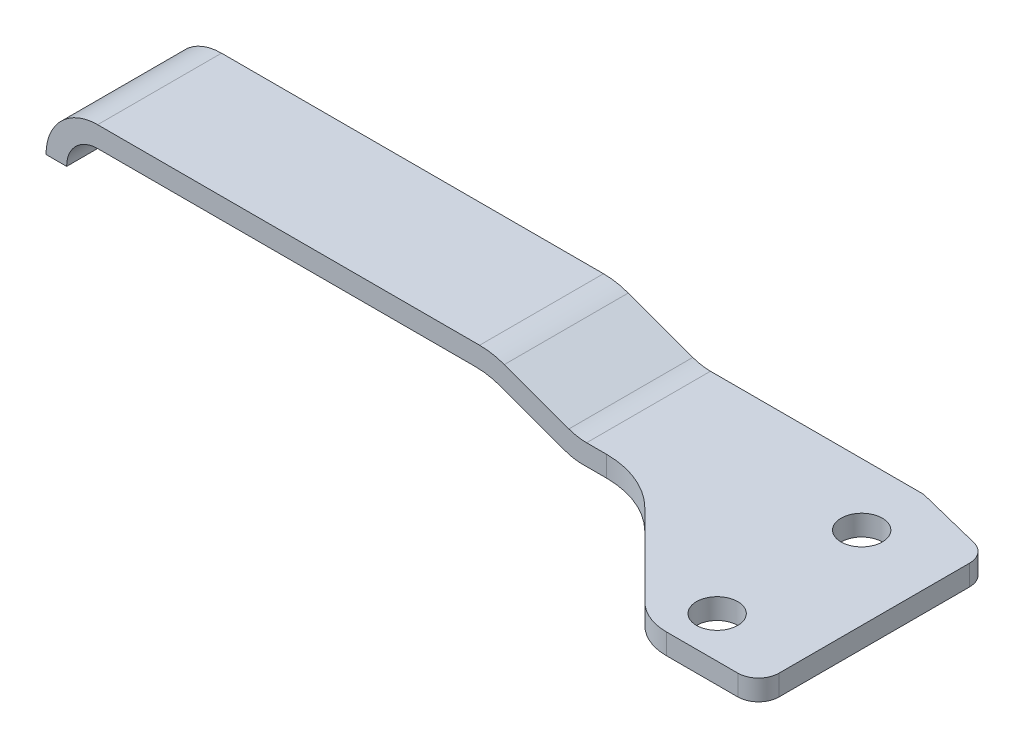
ISO-10303-21;
HEADER;
FILE_DESCRIPTION(('STEP AP214'),'2;1');
FILE_NAME('part.step','',(''),(''),'','','');
FILE_SCHEMA(('AUTOMOTIVE_DESIGN { 1 0 10303 214 1 1 1 1 }'));
ENDSEC;
DATA;
#1=APPLICATION_CONTEXT('core data for automotive mechanical design processes');
#2=APPLICATION_PROTOCOL_DEFINITION('international standard','automotive_design',2000,#1);
#3=PRODUCT_CONTEXT('',#1,'mechanical');
#4=PRODUCT('Part','Part','',(#3));
#5=PRODUCT_RELATED_PRODUCT_CATEGORY('part','',(#4));
#6=PRODUCT_DEFINITION_FORMATION('','',#4);
#7=PRODUCT_DEFINITION_CONTEXT('part definition',#1,'design');
#8=PRODUCT_DEFINITION('design','',#6,#7);
#9=PRODUCT_DEFINITION_SHAPE('','',#8);
#10=(LENGTH_UNIT() NAMED_UNIT(*) SI_UNIT(.MILLI.,.METRE.));
#11=(NAMED_UNIT(*) PLANE_ANGLE_UNIT() SI_UNIT($,.RADIAN.));
#12=(NAMED_UNIT(*) SI_UNIT($,.STERADIAN.) SOLID_ANGLE_UNIT());
#13=UNCERTAINTY_MEASURE_WITH_UNIT(LENGTH_MEASURE(1.E-05),#10,'distance_accuracy_value','');
#14=(GEOMETRIC_REPRESENTATION_CONTEXT(3) GLOBAL_UNCERTAINTY_ASSIGNED_CONTEXT((#13)) GLOBAL_UNIT_ASSIGNED_CONTEXT((#10,
#11,#12)) REPRESENTATION_CONTEXT('',''));
#15=CARTESIAN_POINT('',(0.,0.,0.));
#16=DIRECTION('',(0.,0.,1.));
#17=DIRECTION('',(1.,0.,0.));
#18=AXIS2_PLACEMENT_3D('',#15,#16,#17);
#19=CARTESIAN_POINT('',(64.3001,7.9375,-19.05));
#20=DIRECTION('',(-1.,0.,0.));
#21=DIRECTION('',(0.,0.,1.));
#22=AXIS2_PLACEMENT_3D('',#19,#20,#21);
#23=PLANE('',#22);
#24=DIRECTION('',(0.,0.,-1.));
#25=VECTOR('',#24,1.);
#26=CARTESIAN_POINT('',(64.3001,3.175,19.05));
#27=LINE('',#26,#25);
#28=CARTESIAN_POINT('',(64.3001,3.175,15.875));
#29=VERTEX_POINT('',#28);
#30=CARTESIAN_POINT('',(64.3001,3.175,-13.4029524997328));
#31=VERTEX_POINT('',#30);
#32=EDGE_CURVE('E307',#29,#31,#27,.T.);
#33=ORIENTED_EDGE('',*,*,#32,.F.);
#34=DIRECTION('',(0.,-1.,0.));
#35=VECTOR('',#34,1.);
#36=CARTESIAN_POINT('',(64.3001,7.9375,15.875));
#37=LINE('',#36,#35);
#38=CARTESIAN_POINT('',(64.3001,0.,15.875));
#39=VERTEX_POINT('',#38);
#40=EDGE_CURVE('E296',#29,#39,#37,.T.);
#41=ORIENTED_EDGE('',*,*,#40,.T.);
#42=DIRECTION('',(0.,0.,-1.));
#43=VECTOR('',#42,1.);
#44=CARTESIAN_POINT('',(64.3001,0.,-19.05));
#45=LINE('',#44,#43);
#46=CARTESIAN_POINT('',(64.3001,0.,-13.4029524997328));
#47=VERTEX_POINT('',#46);
#48=EDGE_CURVE('E273',#39,#47,#45,.T.);
#49=ORIENTED_EDGE('',*,*,#48,.T.);
#50=DIRECTION('',(0.,1.,0.));
#51=VECTOR('',#50,1.);
#52=CARTESIAN_POINT('',(64.3001,7.9375,-13.4029524997328));
#53=LINE('',#52,#51);
#54=EDGE_CURVE('E293',#47,#31,#53,.T.);
#55=ORIENTED_EDGE('',*,*,#54,.T.);
#56=EDGE_LOOP('',(#33,#41,#49,#55));
#57=FACE_BOUND('',#56,.T.);
#58=ADVANCED_FACE('F164',(#57),#23,.F.);
#59=CARTESIAN_POINT('',(-64.3001,7.9375,-19.05));
#60=DIRECTION('',(0.,0.,1.));
#61=DIRECTION('',(1.,0.,0.));
#62=AXIS2_PLACEMENT_3D('',#59,#60,#61);
#63=PLANE('',#62);
#64=CARTESIAN_POINT('',(-56.3626,0.,-19.05));
#65=DIRECTION('',(0.,0.,-1.));
#66=DIRECTION('',(-1.,0.,0.));
#67=AXIS2_PLACEMENT_3D('',#64,#65,#66);
#68=CIRCLE('',#67,7.93749999999999);
#69=CARTESIAN_POINT('',(-64.3001,0.,-19.05));
#70=VERTEX_POINT('',#69);
#71=CARTESIAN_POINT('',(-56.3626,7.9375,-19.05));
#72=VERTEX_POINT('',#71);
#73=EDGE_CURVE('E168',#70,#72,#68,.T.);
#74=ORIENTED_EDGE('',*,*,#73,.T.);
#75=DIRECTION('',(-1.,0.,0.));
#76=VECTOR('',#75,1.);
#77=CARTESIAN_POINT('',(-64.3001,7.9375,-19.05));
#78=LINE('',#77,#76);
#79=CARTESIAN_POINT('',(2.37489999999999,7.9375,-19.05));
#80=VERTEX_POINT('',#79);
#81=EDGE_CURVE('E249',#80,#72,#78,.T.);
#82=ORIENTED_EDGE('',*,*,#81,.F.);
#83=CARTESIAN_POINT('',(2.37489999999999,-3.1877,-19.05));
#84=DIRECTION('',(0.,0.,-1.));
#85=DIRECTION('',(-1.,0.,0.));
#86=AXIS2_PLACEMENT_3D('',#83,#84,#85);
#87=CIRCLE('',#86,11.1252);
#88=CARTESIAN_POINT('',(6.17994249852665,7.26656834476741,-19.05));
#89=VERTEX_POINT('',#88);
#90=EDGE_CURVE('E337',#80,#89,#87,.T.);
#91=ORIENTED_EDGE('',*,*,#90,.T.);
#92=DIRECTION('',(-0.939692620785911,0.342020143325663,0.));
#93=VECTOR('',#92,1.);
#94=CARTESIAN_POINT('',(16.1041403544914,3.65445572622783,-19.05));
#95=LINE('',#94,#93);
#96=CARTESIAN_POINT('',(16.1041403544914,3.65445572622785,-19.05));
#97=VERTEX_POINT('',#96);
#98=EDGE_CURVE('E333',#89,#97,#95,.F.);
#99=ORIENTED_EDGE('',*,*,#98,.T.);
#100=CARTESIAN_POINT('',(18.8232688979591,11.1252,-19.05));
#101=DIRECTION('',(0.,0.,-1.));
#102=DIRECTION('',(-1.,0.,0.));
#103=AXIS2_PLACEMENT_3D('',#100,#101,#102);
#104=CIRCLE('',#103,7.9502);
#105=CARTESIAN_POINT('',(18.8232688979591,3.175,-19.05));
#106=VERTEX_POINT('',#105);
#107=EDGE_CURVE('E331',#106,#97,#104,.T.);
#108=ORIENTED_EDGE('',*,*,#107,.F.);
#109=DIRECTION('',(-1.,0.,0.));
#110=VECTOR('',#109,1.);
#111=CARTESIAN_POINT('',(-64.3001,3.17500000000002,-19.05));
#112=LINE('',#111,#110);
#113=CARTESIAN_POINT('',(51.2102590191333,3.175,-19.05));
#114=VERTEX_POINT('',#113);
#115=EDGE_CURVE('E402',#114,#106,#112,.T.);
#116=ORIENTED_EDGE('',*,*,#115,.F.);
#117=DIRECTION('',(0.,1.,0.));
#118=VECTOR('',#117,1.);
#119=CARTESIAN_POINT('',(51.2102590191333,7.9375,-19.05));
#120=LINE('',#119,#118);
#121=CARTESIAN_POINT('',(51.2102590191333,0.,-19.05));
#122=VERTEX_POINT('',#121);
#123=EDGE_CURVE('E281',#114,#122,#120,.F.);
#124=ORIENTED_EDGE('',*,*,#123,.T.);
#125=DIRECTION('',(-1.,0.,0.));
#126=VECTOR('',#125,1.);
#127=CARTESIAN_POINT('',(-64.3001,0.,-19.05));
#128=LINE('',#127,#126);
#129=CARTESIAN_POINT('',(17.8007076247308,0.,-19.05));
#130=VERTEX_POINT('',#129);
#131=EDGE_CURVE('E276',#122,#130,#128,.T.);
#132=ORIENTED_EDGE('',*,*,#131,.T.);
#133=CARTESIAN_POINT('',(18.2499,7.9375,-19.05));
#134=DIRECTION('',(0.,0.,-1.));
#135=DIRECTION('',(-1.,0.,0.));
#136=AXIS2_PLACEMENT_3D('',#133,#134,#135);
#137=CIRCLE('',#136,7.9502);
#138=CARTESIAN_POINT('',(15.5307714565323,0.466755726227857,-19.05));
#139=VERTEX_POINT('',#138);
#140=EDGE_CURVE('E255',#130,#139,#137,.T.);
#141=ORIENTED_EDGE('',*,*,#140,.T.);
#142=DIRECTION('',(-0.939692620785911,0.342020143325663,0.));
#143=VECTOR('',#142,1.);
#144=CARTESIAN_POINT('',(1.96676754123714,5.40364940886543,-19.05));
#145=LINE('',#144,#143);
#146=CARTESIAN_POINT('',(5.57168063734052,4.09156834476741,-19.05));
#147=VERTEX_POINT('',#146);
#148=EDGE_CURVE('E345',#147,#139,#145,.F.);
#149=ORIENTED_EDGE('',*,*,#148,.F.);
#150=CARTESIAN_POINT('',(1.76663813881386,-6.36270000000001,-19.05));
#151=DIRECTION('',(0.,0.,-1.));
#152=DIRECTION('',(-1.,0.,0.));
#153=AXIS2_PLACEMENT_3D('',#150,#151,#152);
#154=CIRCLE('',#153,11.1252);
#155=CARTESIAN_POINT('',(1.76663813881386,4.76249999999999,-19.05));
#156=VERTEX_POINT('',#155);
#157=EDGE_CURVE('E343',#156,#147,#154,.T.);
#158=ORIENTED_EDGE('',*,*,#157,.F.);
#159=DIRECTION('',(-1.,0.,0.));
#160=VECTOR('',#159,1.);
#161=CARTESIAN_POINT('',(0.,4.76249999999999,-19.05));
#162=LINE('',#161,#160);
#163=CARTESIAN_POINT('',(-56.3626,4.7625,-19.05));
#164=VERTEX_POINT('',#163);
#165=EDGE_CURVE('E341',#164,#156,#162,.F.);
#166=ORIENTED_EDGE('',*,*,#165,.F.);
#167=CARTESIAN_POINT('',(-56.3626,0.,-19.05));
#168=DIRECTION('',(0.,0.,-1.));
#169=DIRECTION('',(-1.,0.,0.));
#170=AXIS2_PLACEMENT_3D('',#167,#168,#169);
#171=CIRCLE('',#170,4.7625);
#172=CARTESIAN_POINT('',(-61.1251,0.,-19.05));
#173=VERTEX_POINT('',#172);
#174=EDGE_CURVE('E339',#173,#164,#171,.T.);
#175=ORIENTED_EDGE('',*,*,#174,.F.);
#176=EDGE_CURVE('E252',#173,#70,#128,.T.);
#177=ORIENTED_EDGE('',*,*,#176,.T.);
#178=EDGE_LOOP('',(#74,#82,#91,#99,#108,#116,#124,#132,#141,#149,#158,#166,#175,#177));
#179=FACE_BOUND('',#178,.T.);
#180=ADVANCED_FACE('F247',(#179),#63,.F.);
#181=CARTESIAN_POINT('',(-64.3001,7.9375,19.05));
#182=DIRECTION('',(0.,0.,-1.));
#183=DIRECTION('',(-1.,0.,0.));
#184=AXIS2_PLACEMENT_3D('',#181,#182,#183);
#185=PLANE('',#184);
#186=DIRECTION('',(1.,0.,0.));
#187=VECTOR('',#186,1.);
#188=CARTESIAN_POINT('',(0.,3.17500000000001,19.05));
#189=LINE('',#188,#187);
#190=CARTESIAN_POINT('',(50.1269,3.175,19.05));
#191=VERTEX_POINT('',#190);
#192=CARTESIAN_POINT('',(61.1251,3.175,19.05));
#193=VERTEX_POINT('',#192);
#194=EDGE_CURVE('E242',#191,#193,#189,.T.);
#195=ORIENTED_EDGE('',*,*,#194,.F.);
#196=DIRECTION('',(0.,1.,0.));
#197=VECTOR('',#196,1.);
#198=CARTESIAN_POINT('',(50.1269,0.,19.05));
#199=LINE('',#198,#197);
#200=CARTESIAN_POINT('',(50.1269,0.,19.05));
#201=VERTEX_POINT('',#200);
#202=EDGE_CURVE('E434',#201,#191,#199,.T.);
#203=ORIENTED_EDGE('',*,*,#202,.F.);
#204=DIRECTION('',(1.,0.,0.));
#205=VECTOR('',#204,1.);
#206=CARTESIAN_POINT('',(-64.3001,0.,19.05));
#207=LINE('',#206,#205);
#208=CARTESIAN_POINT('',(61.1251,0.,19.05));
#209=VERTEX_POINT('',#208);
#210=EDGE_CURVE('E261',#201,#209,#207,.T.);
#211=ORIENTED_EDGE('',*,*,#210,.T.);
#212=DIRECTION('',(0.,-1.,0.));
#213=VECTOR('',#212,1.);
#214=CARTESIAN_POINT('',(61.1251,7.9375,19.05));
#215=LINE('',#214,#213);
#216=EDGE_CURVE('E299',#209,#193,#215,.F.);
#217=ORIENTED_EDGE('',*,*,#216,.T.);
#218=EDGE_LOOP('',(#195,#203,#211,#217));
#219=FACE_BOUND('',#218,.T.);
#220=ADVANCED_FACE('F460',(#219),#185,.F.);
#221=CARTESIAN_POINT('',(0.,7.9375,0.));
#222=DIRECTION('',(0.,1.,0.));
#223=DIRECTION('',(0.,0.,1.));
#224=AXIS2_PLACEMENT_3D('',#221,#222,#223);
#225=PLANE('',#224);
#226=DIRECTION('',(0.,0.,-1.));
#227=VECTOR('',#226,1.);
#228=CARTESIAN_POINT('',(-56.3626,7.9375,19.05));
#229=LINE('',#228,#227);
#230=CARTESIAN_POINT('',(-56.3626,7.9375,0.));
#231=VERTEX_POINT('',#230);
#232=EDGE_CURVE('E235',#231,#72,#229,.T.);
#233=ORIENTED_EDGE('',*,*,#232,.F.);
#234=DIRECTION('',(-1.,0.,0.));
#235=VECTOR('',#234,1.);
#236=CARTESIAN_POINT('',(-64.3001,7.9375,0.));
#237=LINE('',#236,#235);
#238=CARTESIAN_POINT('',(2.37489999999999,7.9375,0.));
#239=VERTEX_POINT('',#238);
#240=EDGE_CURVE('E421',#239,#231,#237,.T.);
#241=ORIENTED_EDGE('',*,*,#240,.F.);
#242=DIRECTION('',(0.,0.,-1.));
#243=VECTOR('',#242,1.);
#244=CARTESIAN_POINT('',(2.37489999999999,7.9375,19.05));
#245=LINE('',#244,#243);
#246=EDGE_CURVE('E259',#239,#80,#245,.T.);
#247=ORIENTED_EDGE('',*,*,#246,.T.);
#248=ORIENTED_EDGE('',*,*,#81,.T.);
#249=EDGE_LOOP('',(#233,#241,#247,#248));
#250=FACE_BOUND('',#249,.T.);
#251=ADVANCED_FACE('F257',(#250),#225,.T.);
#252=CARTESIAN_POINT('',(0.,0.,0.));
#253=DIRECTION('',(0.,1.,0.));
#254=DIRECTION('',(0.,0.,1.));
#255=AXIS2_PLACEMENT_3D('',#252,#253,#254);
#256=PLANE('',#255);
#257=CARTESIAN_POINT('',(51.6001,0.,-9.525));
#258=DIRECTION('',(0.,1.,0.));
#259=DIRECTION('',(0.,0.,1.));
#260=AXIS2_PLACEMENT_3D('',#257,#258,#259);
#261=CIRCLE('',#260,3.175);
#262=CARTESIAN_POINT('',(51.6001,0.,-6.35));
#263=VERTEX_POINT('',#262);
#264=EDGE_CURVE('E418',#263,#263,#261,.T.);
#265=ORIENTED_EDGE('',*,*,#264,.T.);
#266=EDGE_LOOP('',(#265));
#267=FACE_BOUND('',#266,.T.);
#268=CARTESIAN_POINT('',(51.6001,0.,12.7));
#269=DIRECTION('',(0.,1.,0.));
#270=DIRECTION('',(0.,0.,1.));
#271=AXIS2_PLACEMENT_3D('',#268,#269,#270);
#272=CIRCLE('',#271,3.175);
#273=CARTESIAN_POINT('',(51.6001,0.,15.875));
#274=VERTEX_POINT('',#273);
#275=EDGE_CURVE('E254',#274,#274,#272,.T.);
#276=ORIENTED_EDGE('',*,*,#275,.T.);
#277=EDGE_LOOP('',(#276));
#278=FACE_BOUND('',#277,.T.);
#279=DIRECTION('',(0.,0.,-1.));
#280=VECTOR('',#279,1.);
#281=CARTESIAN_POINT('',(17.8007076247308,0.,19.05));
#282=LINE('',#281,#280);
#283=CARTESIAN_POINT('',(17.8007076247308,0.,0.));
#284=VERTEX_POINT('',#283);
#285=EDGE_CURVE('E243',#284,#130,#282,.T.);
#286=ORIENTED_EDGE('',*,*,#285,.T.);
#287=ORIENTED_EDGE('',*,*,#131,.F.);
#288=CARTESIAN_POINT('',(51.2102590191333,0.,-15.875));
#289=DIRECTION('',(0.,1.,0.));
#290=DIRECTION('',(0.,0.,1.));
#291=AXIS2_PLACEMENT_3D('',#288,#289,#290);
#292=CIRCLE('',#291,3.175);
#293=CARTESIAN_POINT('',(51.9783610376622,0.,-18.9556889309263));
#294=VERTEX_POINT('',#293);
#295=EDGE_CURVE('E290',#122,#294,#292,.F.);
#296=ORIENTED_EDGE('',*,*,#295,.T.);
#297=DIRECTION('',(0.970295726275998,0.,0.241921895599662));
#298=VECTOR('',#297,1.);
#299=CARTESIAN_POINT('',(51.6001,0.,-19.05));
#300=LINE('',#299,#298);
#301=CARTESIAN_POINT('',(61.8932020185289,0.,-16.4836414306591));
#302=VERTEX_POINT('',#301);
#303=EDGE_CURVE('E271',#294,#302,#300,.T.);
#304=ORIENTED_EDGE('',*,*,#303,.T.);
#305=CARTESIAN_POINT('',(61.1251,0.,-13.4029524997328));
#306=DIRECTION('',(0.,1.,0.));
#307=DIRECTION('',(0.,0.,1.));
#308=AXIS2_PLACEMENT_3D('',#305,#306,#307);
#309=CIRCLE('',#308,3.175);
#310=EDGE_CURVE('E284',#302,#47,#309,.F.);
#311=ORIENTED_EDGE('',*,*,#310,.T.);
#312=ORIENTED_EDGE('',*,*,#48,.F.);
#313=CARTESIAN_POINT('',(61.1251,0.,15.875));
#314=DIRECTION('',(0.,1.,0.));
#315=DIRECTION('',(0.,0.,1.));
#316=AXIS2_PLACEMENT_3D('',#313,#314,#315);
#317=CIRCLE('',#316,3.175);
#318=EDGE_CURVE('E287',#39,#209,#317,.F.);
#319=ORIENTED_EDGE('',*,*,#318,.T.);
#320=ORIENTED_EDGE('',*,*,#210,.F.);
#321=CARTESIAN_POINT('',(50.1269,0.,11.0998));
#322=DIRECTION('',(0.,-1.,0.));
#323=DIRECTION('',(0.,0.,1.));
#324=AXIS2_PLACEMENT_3D('',#321,#322,#323);
#325=CIRCLE('',#324,7.9502);
#326=CARTESIAN_POINT('',(44.5052596682107,0.,16.7214403317893));
#327=VERTEX_POINT('',#326);
#328=EDGE_CURVE('E424',#201,#327,#325,.T.);
#329=ORIENTED_EDGE('',*,*,#328,.T.);
#330=DIRECTION('',(-0.707106781186552,0.,-0.707106781186543));
#331=VECTOR('',#330,1.);
#332=CARTESIAN_POINT('',(31.9722509440973,0.,4.18843160767608));
#333=LINE('',#332,#331);
#334=CARTESIAN_POINT('',(31.9722509440973,0.,4.18843160767608));
#335=VERTEX_POINT('',#334);
#336=EDGE_CURVE('E427',#327,#335,#333,.T.);
#337=ORIENTED_EDGE('',*,*,#336,.T.);
#338=CARTESIAN_POINT('',(21.8604825517735,0.,14.3002));
#339=DIRECTION('',(0.,1.,0.));
#340=DIRECTION('',(0.,0.,1.));
#341=AXIS2_PLACEMENT_3D('',#338,#339,#340);
#342=CIRCLE('',#341,14.3002);
#343=CARTESIAN_POINT('',(21.8604825517735,0.,0.));
#344=VERTEX_POINT('',#343);
#345=EDGE_CURVE('E430',#335,#344,#342,.T.);
#346=ORIENTED_EDGE('',*,*,#345,.T.);
#347=DIRECTION('',(-1.,0.,0.));
#348=VECTOR('',#347,1.);
#349=CARTESIAN_POINT('',(-64.3001,0.,0.));
#350=LINE('',#349,#348);
#351=EDGE_CURVE('E365',#344,#284,#350,.T.);
#352=ORIENTED_EDGE('',*,*,#351,.T.);
#353=EDGE_LOOP('',(#286,#287,#296,#304,#311,#312,#319,#320,#329,#337,#346,#352));
#354=FACE_BOUND('',#353,.T.);
#355=ADVANCED_FACE('F360',(#267,#278,#354),#256,.F.);
#356=CARTESIAN_POINT('',(51.6001,0.,-19.05));
#357=DIRECTION('',(-0.241921895599662,0.,0.970295726275998));
#358=DIRECTION('',(0.970295726275998,0.,0.241921895599662));
#359=AXIS2_PLACEMENT_3D('',#356,#357,#358);
#360=PLANE('',#359);
#361=DIRECTION('',(-0.970295726275998,0.,-0.241921895599662));
#362=VECTOR('',#361,1.);
#363=CARTESIAN_POINT('',(51.6001,3.175,-19.05));
#364=LINE('',#363,#362);
#365=CARTESIAN_POINT('',(61.8932020185289,3.175,-16.4836414306591));
#366=VERTEX_POINT('',#365);
#367=CARTESIAN_POINT('',(51.9783610376622,3.175,-18.9556889309263));
#368=VERTEX_POINT('',#367);
#369=EDGE_CURVE('E396',#366,#368,#364,.T.);
#370=ORIENTED_EDGE('',*,*,#369,.F.);
#371=DIRECTION('',(0.,1.,0.));
#372=VECTOR('',#371,1.);
#373=CARTESIAN_POINT('',(61.8932020185289,0.,-16.4836414306591));
#374=LINE('',#373,#372);
#375=EDGE_CURVE('E260',#366,#302,#374,.F.);
#376=ORIENTED_EDGE('',*,*,#375,.T.);
#377=ORIENTED_EDGE('',*,*,#303,.F.);
#378=DIRECTION('',(0.,1.,0.));
#379=VECTOR('',#378,1.);
#380=CARTESIAN_POINT('',(51.9783610376622,0.,-18.9556889309263));
#381=LINE('',#380,#379);
#382=EDGE_CURVE('E264',#294,#368,#381,.T.);
#383=ORIENTED_EDGE('',*,*,#382,.T.);
#384=EDGE_LOOP('',(#370,#376,#377,#383));
#385=FACE_BOUND('',#384,.T.);
#386=ADVANCED_FACE('F546',(#385),#360,.F.);
#387=CARTESIAN_POINT('',(-64.3001,0.,0.));
#388=DIRECTION('',(0.,0.,-1.));
#389=DIRECTION('',(-1.,0.,0.));
#390=AXIS2_PLACEMENT_3D('',#387,#388,#389);
#391=PLANE('',#390);
#392=CARTESIAN_POINT('',(-56.3626,0.,0.));
#393=DIRECTION('',(0.,0.,-1.));
#394=DIRECTION('',(-1.,0.,0.));
#395=AXIS2_PLACEMENT_3D('',#392,#393,#394);
#396=CIRCLE('',#395,7.93749999999999);
#397=CARTESIAN_POINT('',(-64.3001,0.,0.));
#398=VERTEX_POINT('',#397);
#399=EDGE_CURVE('E12',#398,#231,#396,.T.);
#400=ORIENTED_EDGE('',*,*,#399,.F.);
#401=CARTESIAN_POINT('',(-61.1251,0.,0.));
#402=VERTEX_POINT('',#401);
#403=EDGE_CURVE('E432',#402,#398,#350,.T.);
#404=ORIENTED_EDGE('',*,*,#403,.F.);
#405=CARTESIAN_POINT('',(-56.3626,0.,0.));
#406=DIRECTION('',(0.,0.,-1.));
#407=DIRECTION('',(-1.,0.,0.));
#408=AXIS2_PLACEMENT_3D('',#405,#406,#407);
#409=CIRCLE('',#408,4.7625);
#410=CARTESIAN_POINT('',(-56.3626,4.7625,0.));
#411=VERTEX_POINT('',#410);
#412=EDGE_CURVE('E316',#402,#411,#409,.T.);
#413=ORIENTED_EDGE('',*,*,#412,.T.);
#414=DIRECTION('',(1.,0.,0.));
#415=VECTOR('',#414,1.);
#416=CARTESIAN_POINT('',(-64.3001,4.7625,0.));
#417=LINE('',#416,#415);
#418=CARTESIAN_POINT('',(1.76663813881386,4.76249999999999,0.));
#419=VERTEX_POINT('',#418);
#420=EDGE_CURVE('E319',#411,#419,#417,.T.);
#421=ORIENTED_EDGE('',*,*,#420,.T.);
#422=CARTESIAN_POINT('',(1.76663813881386,-6.36270000000001,0.));
#423=DIRECTION('',(0.,0.,-1.));
#424=DIRECTION('',(-1.,0.,0.));
#425=AXIS2_PLACEMENT_3D('',#422,#423,#424);
#426=CIRCLE('',#425,11.1252);
#427=CARTESIAN_POINT('',(5.57168063734052,4.0915683447674,0.));
#428=VERTEX_POINT('',#427);
#429=EDGE_CURVE('E322',#419,#428,#426,.T.);
#430=ORIENTED_EDGE('',*,*,#429,.T.);
#431=DIRECTION('',(0.939692620785911,-0.342020143325663,0.));
#432=VECTOR('',#431,1.);
#433=CARTESIAN_POINT('',(-54.8116496072604,26.0693031996679,0.));
#434=LINE('',#433,#432);
#435=CARTESIAN_POINT('',(15.5307714565323,0.466755726227857,0.));
#436=VERTEX_POINT('',#435);
#437=EDGE_CURVE('E325',#428,#436,#434,.T.);
#438=ORIENTED_EDGE('',*,*,#437,.T.);
#439=CARTESIAN_POINT('',(18.2499,7.9375,0.));
#440=DIRECTION('',(0.,0.,-1.));
#441=DIRECTION('',(-1.,0.,0.));
#442=AXIS2_PLACEMENT_3D('',#439,#440,#441);
#443=CIRCLE('',#442,7.9502);
#444=EDGE_CURVE('E174',#284,#436,#443,.T.);
#445=ORIENTED_EDGE('',*,*,#444,.F.);
#446=ORIENTED_EDGE('',*,*,#351,.F.);
#447=DIRECTION('',(0.,1.,0.));
#448=VECTOR('',#447,1.);
#449=CARTESIAN_POINT('',(21.8604825517735,0.,0.));
#450=LINE('',#449,#448);
#451=CARTESIAN_POINT('',(21.8604825517735,3.175,0.));
#452=VERTEX_POINT('',#451);
#453=EDGE_CURVE('E436',#344,#452,#450,.T.);
#454=ORIENTED_EDGE('',*,*,#453,.T.);
#455=DIRECTION('',(1.,0.,0.));
#456=VECTOR('',#455,1.);
#457=CARTESIAN_POINT('',(-64.3001,3.17500000000002,0.));
#458=LINE('',#457,#456);
#459=CARTESIAN_POINT('',(18.8232688979591,3.175,0.));
#460=VERTEX_POINT('',#459);
#461=EDGE_CURVE('E334',#460,#452,#458,.T.);
#462=ORIENTED_EDGE('',*,*,#461,.F.);
#463=CARTESIAN_POINT('',(18.8232688979591,11.1252,0.));
#464=DIRECTION('',(0.,0.,-1.));
#465=DIRECTION('',(-1.,0.,0.));
#466=AXIS2_PLACEMENT_3D('',#463,#464,#465);
#467=CIRCLE('',#466,7.9502);
#468=CARTESIAN_POINT('',(16.1041403544914,3.65445572622785,0.));
#469=VERTEX_POINT('',#468);
#470=EDGE_CURVE('E302',#460,#469,#467,.T.);
#471=ORIENTED_EDGE('',*,*,#470,.T.);
#472=DIRECTION('',(0.939692620785911,-0.342020143325663,0.));
#473=VECTOR('',#472,1.);
#474=CARTESIAN_POINT('',(-53.7200711556514,29.0683903470269,0.));
#475=LINE('',#474,#473);
#476=CARTESIAN_POINT('',(6.17994249852665,7.26656834476741,0.));
#477=VERTEX_POINT('',#476);
#478=EDGE_CURVE('E310',#477,#469,#475,.T.);
#479=ORIENTED_EDGE('',*,*,#478,.F.);
#480=CARTESIAN_POINT('',(2.37489999999999,-3.1877,0.));
#481=DIRECTION('',(0.,0.,-1.));
#482=DIRECTION('',(-1.,0.,0.));
#483=AXIS2_PLACEMENT_3D('',#480,#481,#482);
#484=CIRCLE('',#483,11.1252);
#485=EDGE_CURVE('E313',#239,#477,#484,.T.);
#486=ORIENTED_EDGE('',*,*,#485,.F.);
#487=ORIENTED_EDGE('',*,*,#240,.T.);
#488=EDGE_LOOP('',(#400,#404,#413,#421,#430,#438,#445,#446,#454,#462,#471,#479,#486,#487));
#489=FACE_BOUND('',#488,.T.);
#490=ADVANCED_FACE('F526',(#489),#391,.F.);
#491=CARTESIAN_POINT('',(21.8604825517735,0.,14.3002));
#492=DIRECTION('',(0.,1.,0.));
#493=DIRECTION('',(0.,0.,1.));
#494=AXIS2_PLACEMENT_3D('',#491,#492,#493);
#495=CYLINDRICAL_SURFACE('',#494,14.3002);
#496=CARTESIAN_POINT('',(21.8604825517735,3.175,14.3002));
#497=DIRECTION('',(0.,1.,0.));
#498=DIRECTION('',(-1.,0.,0.));
#499=AXIS2_PLACEMENT_3D('',#496,#497,#498);
#500=CIRCLE('',#499,14.3002);
#501=CARTESIAN_POINT('',(31.9722509440973,3.175,4.18843160767608));
#502=VERTEX_POINT('',#501);
#503=EDGE_CURVE('E413',#452,#502,#500,.F.);
#504=ORIENTED_EDGE('',*,*,#503,.F.);
#505=ORIENTED_EDGE('',*,*,#453,.F.);
#506=ORIENTED_EDGE('',*,*,#345,.F.);
#507=DIRECTION('',(0.,1.,0.));
#508=VECTOR('',#507,1.);
#509=CARTESIAN_POINT('',(31.9722509440973,0.,4.18843160767608));
#510=LINE('',#509,#508);
#511=EDGE_CURVE('E439',#335,#502,#510,.T.);
#512=ORIENTED_EDGE('',*,*,#511,.T.);
#513=EDGE_LOOP('',(#504,#505,#506,#512));
#514=FACE_BOUND('',#513,.T.);
#515=ADVANCED_FACE('F557',(#514),#495,.F.);
#516=CARTESIAN_POINT('',(31.9722509440973,0.,4.18843160767608));
#517=DIRECTION('',(0.707106781186543,0.,-0.707106781186552));
#518=DIRECTION('',(-0.707106781186552,0.,-0.707106781186543));
#519=AXIS2_PLACEMENT_3D('',#516,#517,#518);
#520=PLANE('',#519);
#521=DIRECTION('',(0.707106781186552,0.,0.707106781186543));
#522=VECTOR('',#521,1.);
#523=CARTESIAN_POINT('',(31.9722509440973,3.175,4.18843160767608));
#524=LINE('',#523,#522);
#525=CARTESIAN_POINT('',(44.5052596682107,3.175,16.7214403317893));
#526=VERTEX_POINT('',#525);
#527=EDGE_CURVE('E410',#502,#526,#524,.T.);
#528=ORIENTED_EDGE('',*,*,#527,.F.);
#529=ORIENTED_EDGE('',*,*,#511,.F.);
#530=ORIENTED_EDGE('',*,*,#336,.F.);
#531=DIRECTION('',(0.,1.,0.));
#532=VECTOR('',#531,1.);
#533=CARTESIAN_POINT('',(44.5052596682107,0.,16.7214403317893));
#534=LINE('',#533,#532);
#535=EDGE_CURVE('E442',#327,#526,#534,.T.);
#536=ORIENTED_EDGE('',*,*,#535,.T.);
#537=EDGE_LOOP('',(#528,#529,#530,#536));
#538=FACE_BOUND('',#537,.T.);
#539=ADVANCED_FACE('F554',(#538),#520,.F.);
#540=CARTESIAN_POINT('',(50.1269,0.,11.0998));
#541=DIRECTION('',(0.,1.,0.));
#542=DIRECTION('',(0.,0.,1.));
#543=AXIS2_PLACEMENT_3D('',#540,#541,#542);
#544=CYLINDRICAL_SURFACE('',#543,7.9502);
#545=CARTESIAN_POINT('',(50.1269,3.175,11.0998));
#546=DIRECTION('',(0.,1.,0.));
#547=DIRECTION('',(-1.,0.,0.));
#548=AXIS2_PLACEMENT_3D('',#545,#546,#547);
#549=CIRCLE('',#548,7.9502);
#550=EDGE_CURVE('E407',#526,#191,#549,.T.);
#551=ORIENTED_EDGE('',*,*,#550,.F.);
#552=ORIENTED_EDGE('',*,*,#535,.F.);
#553=ORIENTED_EDGE('',*,*,#328,.F.);
#554=ORIENTED_EDGE('',*,*,#202,.T.);
#555=EDGE_LOOP('',(#551,#552,#553,#554));
#556=FACE_BOUND('',#555,.T.);
#557=ADVANCED_FACE('F450',(#556),#544,.T.);
#558=CARTESIAN_POINT('',(51.2102590191333,0.,-15.875));
#559=DIRECTION('',(0.,1.,0.));
#560=DIRECTION('',(0.,0.,1.));
#561=AXIS2_PLACEMENT_3D('',#558,#559,#560);
#562=CYLINDRICAL_SURFACE('',#561,3.175);
#563=ORIENTED_EDGE('',*,*,#123,.F.);
#564=CARTESIAN_POINT('',(51.2102590191333,3.175,-15.875));
#565=DIRECTION('',(0.,1.,0.));
#566=DIRECTION('',(-1.,0.,0.));
#567=AXIS2_PLACEMENT_3D('',#564,#565,#566);
#568=CIRCLE('',#567,3.175);
#569=EDGE_CURVE('E399',#114,#368,#568,.F.);
#570=ORIENTED_EDGE('',*,*,#569,.T.);
#571=ORIENTED_EDGE('',*,*,#382,.F.);
#572=ORIENTED_EDGE('',*,*,#295,.F.);
#573=EDGE_LOOP('',(#563,#570,#571,#572));
#574=FACE_BOUND('',#573,.T.);
#575=ADVANCED_FACE('F539',(#574),#562,.T.);
#576=CARTESIAN_POINT('',(61.1251,7.9375,15.875));
#577=DIRECTION('',(0.,-1.,0.));
#578=DIRECTION('',(0.,0.,-1.));
#579=AXIS2_PLACEMENT_3D('',#576,#577,#578);
#580=CYLINDRICAL_SURFACE('',#579,3.175);
#581=ORIENTED_EDGE('',*,*,#40,.F.);
#582=CARTESIAN_POINT('',(61.1251,3.175,15.875));
#583=DIRECTION('',(0.,1.,0.));
#584=DIRECTION('',(-1.,0.,0.));
#585=AXIS2_PLACEMENT_3D('',#582,#583,#584);
#586=CIRCLE('',#585,3.175);
#587=EDGE_CURVE('E404',#29,#193,#586,.F.);
#588=ORIENTED_EDGE('',*,*,#587,.T.);
#589=ORIENTED_EDGE('',*,*,#216,.F.);
#590=ORIENTED_EDGE('',*,*,#318,.F.);
#591=EDGE_LOOP('',(#581,#588,#589,#590));
#592=FACE_BOUND('',#591,.T.);
#593=ADVANCED_FACE('F471',(#592),#580,.T.);
#594=CARTESIAN_POINT('',(61.1251,7.9375,-13.4029524997328));
#595=DIRECTION('',(0.,1.,0.));
#596=DIRECTION('',(0.,0.,1.));
#597=AXIS2_PLACEMENT_3D('',#594,#595,#596);
#598=CYLINDRICAL_SURFACE('',#597,3.175);
#599=ORIENTED_EDGE('',*,*,#375,.F.);
#600=CARTESIAN_POINT('',(61.1251,3.175,-13.4029524997328));
#601=DIRECTION('',(0.,1.,0.));
#602=DIRECTION('',(-1.,0.,0.));
#603=AXIS2_PLACEMENT_3D('',#600,#601,#602);
#604=CIRCLE('',#603,3.175);
#605=EDGE_CURVE('E393',#366,#31,#604,.F.);
#606=ORIENTED_EDGE('',*,*,#605,.T.);
#607=ORIENTED_EDGE('',*,*,#54,.F.);
#608=ORIENTED_EDGE('',*,*,#310,.F.);
#609=EDGE_LOOP('',(#599,#606,#607,#608));
#610=FACE_BOUND('',#609,.T.);
#611=ADVANCED_FACE('F166',(#610),#598,.T.);
#612=CARTESIAN_POINT('',(51.6001,0.,12.7));
#613=DIRECTION('',(0.,1.,0.));
#614=DIRECTION('',(0.,0.,1.));
#615=AXIS2_PLACEMENT_3D('',#612,#613,#614);
#616=CYLINDRICAL_SURFACE('',#615,3.175);
#617=ORIENTED_EDGE('',*,*,#275,.F.);
#618=EDGE_LOOP('',(#617));
#619=FACE_BOUND('',#618,.T.);
#620=CARTESIAN_POINT('',(51.6001,3.175,12.7));
#621=DIRECTION('',(0.,1.,0.));
#622=DIRECTION('',(-1.,0.,0.));
#623=AXIS2_PLACEMENT_3D('',#620,#621,#622);
#624=CIRCLE('',#623,3.175);
#625=CARTESIAN_POINT('',(48.4251,3.175,12.7));
#626=VERTEX_POINT('',#625);
#627=EDGE_CURVE('E306',#626,#626,#624,.F.);
#628=ORIENTED_EDGE('',*,*,#627,.F.);
#629=EDGE_LOOP('',(#628));
#630=FACE_BOUND('',#629,.T.);
#631=ADVANCED_FACE('F594',(#619,#630),#616,.F.);
#632=CARTESIAN_POINT('',(51.6001,0.,-9.525));
#633=DIRECTION('',(0.,1.,0.));
#634=DIRECTION('',(0.,0.,1.));
#635=AXIS2_PLACEMENT_3D('',#632,#633,#634);
#636=CYLINDRICAL_SURFACE('',#635,3.175);
#637=ORIENTED_EDGE('',*,*,#264,.F.);
#638=EDGE_LOOP('',(#637));
#639=FACE_BOUND('',#638,.T.);
#640=CARTESIAN_POINT('',(51.6001,3.175,-9.525));
#641=DIRECTION('',(0.,1.,0.));
#642=DIRECTION('',(-1.,0.,0.));
#643=AXIS2_PLACEMENT_3D('',#640,#641,#642);
#644=CIRCLE('',#643,3.175);
#645=CARTESIAN_POINT('',(48.4251,3.175,-9.525));
#646=VERTEX_POINT('',#645);
#647=EDGE_CURVE('E303',#646,#646,#644,.F.);
#648=ORIENTED_EDGE('',*,*,#647,.F.);
#649=EDGE_LOOP('',(#648));
#650=FACE_BOUND('',#649,.T.);
#651=ADVANCED_FACE('F598',(#639,#650),#636,.F.);
#652=ORIENTED_EDGE('',*,*,#176,.F.);
#653=DIRECTION('',(0.,0.,-1.));
#654=VECTOR('',#653,1.);
#655=CARTESIAN_POINT('',(-61.1251,0.,19.05));
#656=LINE('',#655,#654);
#657=EDGE_CURVE('E373',#402,#173,#656,.T.);
#658=ORIENTED_EDGE('',*,*,#657,.F.);
#659=ORIENTED_EDGE('',*,*,#403,.T.);
#660=DIRECTION('',(0.,0.,1.));
#661=VECTOR('',#660,1.);
#662=CARTESIAN_POINT('',(-64.3001,0.,-19.05));
#663=LINE('',#662,#661);
#664=EDGE_CURVE('E267',#70,#398,#663,.T.);
#665=ORIENTED_EDGE('',*,*,#664,.F.);
#666=EDGE_LOOP('',(#652,#658,#659,#665));
#667=FACE_BOUND('',#666,.T.);
#668=ADVANCED_FACE('F570',(#667),#256,.F.);
#669=CARTESIAN_POINT('',(2.37489999999999,-3.1877,19.05));
#670=DIRECTION('',(0.,0.,-1.));
#671=DIRECTION('',(-1.,0.,0.));
#672=AXIS2_PLACEMENT_3D('',#669,#670,#671);
#673=CYLINDRICAL_SURFACE('',#672,11.1252);
#674=ORIENTED_EDGE('',*,*,#90,.F.);
#675=ORIENTED_EDGE('',*,*,#246,.F.);
#676=ORIENTED_EDGE('',*,*,#485,.T.);
#677=DIRECTION('',(0.,0.,-1.));
#678=VECTOR('',#677,1.);
#679=CARTESIAN_POINT('',(6.17994249852665,7.26656834476741,19.05));
#680=LINE('',#679,#678);
#681=EDGE_CURVE('E383',#477,#89,#680,.T.);
#682=ORIENTED_EDGE('',*,*,#681,.T.);
#683=EDGE_LOOP('',(#674,#675,#676,#682));
#684=FACE_BOUND('',#683,.T.);
#685=ADVANCED_FACE('F522',(#684),#673,.T.);
#686=CARTESIAN_POINT('',(3.05834599284615,8.40273655622448,19.05));
#687=DIRECTION('',(0.342020143325663,0.939692620785911,0.));
#688=DIRECTION('',(-0.939692620785911,0.342020143325663,0.));
#689=AXIS2_PLACEMENT_3D('',#686,#687,#688);
#690=PLANE('',#689);
#691=ORIENTED_EDGE('',*,*,#98,.F.);
#692=ORIENTED_EDGE('',*,*,#681,.F.);
#693=ORIENTED_EDGE('',*,*,#478,.T.);
#694=DIRECTION('',(0.,0.,-1.));
#695=VECTOR('',#694,1.);
#696=CARTESIAN_POINT('',(16.1041403544914,3.65445572622785,19.05));
#697=LINE('',#696,#695);
#698=EDGE_CURVE('E386',#469,#97,#697,.T.);
#699=ORIENTED_EDGE('',*,*,#698,.T.);
#700=EDGE_LOOP('',(#691,#692,#693,#699));
#701=FACE_BOUND('',#700,.T.);
#702=ADVANCED_FACE('F530',(#701),#690,.T.);
#703=CARTESIAN_POINT('',(18.8232688979591,11.1252,19.05));
#704=DIRECTION('',(0.,0.,-1.));
#705=DIRECTION('',(-1.,0.,0.));
#706=AXIS2_PLACEMENT_3D('',#703,#704,#705);
#707=CYLINDRICAL_SURFACE('',#706,7.9502);
#708=ORIENTED_EDGE('',*,*,#698,.F.);
#709=ORIENTED_EDGE('',*,*,#470,.F.);
#710=DIRECTION('',(0.,0.,-1.));
#711=VECTOR('',#710,1.);
#712=CARTESIAN_POINT('',(18.8232688979591,3.175,19.05));
#713=LINE('',#712,#711);
#714=EDGE_CURVE('E380',#460,#106,#713,.T.);
#715=ORIENTED_EDGE('',*,*,#714,.T.);
#716=ORIENTED_EDGE('',*,*,#107,.T.);
#717=EDGE_LOOP('',(#708,#709,#715,#716));
#718=FACE_BOUND('',#717,.T.);
#719=ADVANCED_FACE('F532',(#718),#707,.F.);
#720=CARTESIAN_POINT('',(0.,3.17500000000001,19.05));
#721=DIRECTION('',(0.,1.,0.));
#722=DIRECTION('',(-1.,0.,0.));
#723=AXIS2_PLACEMENT_3D('',#720,#721,#722);
#724=PLANE('',#723);
#725=ORIENTED_EDGE('',*,*,#647,.T.);
#726=EDGE_LOOP('',(#725));
#727=FACE_BOUND('',#726,.T.);
#728=ORIENTED_EDGE('',*,*,#627,.T.);
#729=EDGE_LOOP('',(#728));
#730=FACE_BOUND('',#729,.T.);
#731=ORIENTED_EDGE('',*,*,#461,.T.);
#732=ORIENTED_EDGE('',*,*,#503,.T.);
#733=ORIENTED_EDGE('',*,*,#527,.T.);
#734=ORIENTED_EDGE('',*,*,#550,.T.);
#735=ORIENTED_EDGE('',*,*,#194,.T.);
#736=ORIENTED_EDGE('',*,*,#587,.F.);
#737=ORIENTED_EDGE('',*,*,#32,.T.);
#738=ORIENTED_EDGE('',*,*,#605,.F.);
#739=ORIENTED_EDGE('',*,*,#369,.T.);
#740=ORIENTED_EDGE('',*,*,#569,.F.);
#741=ORIENTED_EDGE('',*,*,#115,.T.);
#742=ORIENTED_EDGE('',*,*,#714,.F.);
#743=EDGE_LOOP('',(#731,#732,#733,#734,#735,#736,#737,#738,#739,#740,#741,#742));
#744=FACE_BOUND('',#743,.T.);
#745=ADVANCED_FACE('F550',(#727,#730,#744),#724,.T.);
#746=CARTESIAN_POINT('',(18.2499,7.9375,19.05));
#747=DIRECTION('',(0.,0.,-1.));
#748=DIRECTION('',(-1.,0.,0.));
#749=AXIS2_PLACEMENT_3D('',#746,#747,#748);
#750=CYLINDRICAL_SURFACE('',#749,7.9502);
#751=ORIENTED_EDGE('',*,*,#140,.F.);
#752=ORIENTED_EDGE('',*,*,#285,.F.);
#753=ORIENTED_EDGE('',*,*,#444,.T.);
#754=DIRECTION('',(0.,0.,-1.));
#755=VECTOR('',#754,1.);
#756=CARTESIAN_POINT('',(15.5307714565323,0.466755726227857,19.05));
#757=LINE('',#756,#755);
#758=EDGE_CURVE('E357',#436,#139,#757,.T.);
#759=ORIENTED_EDGE('',*,*,#758,.T.);
#760=EDGE_LOOP('',(#751,#752,#753,#759));
#761=FACE_BOUND('',#760,.T.);
#762=ADVANCED_FACE('F354',(#761),#750,.T.);
#763=CARTESIAN_POINT('',(1.96676754123714,5.40364940886543,19.05));
#764=DIRECTION('',(0.342020143325663,0.939692620785911,0.));
#765=DIRECTION('',(-0.939692620785911,0.342020143325663,0.));
#766=AXIS2_PLACEMENT_3D('',#763,#764,#765);
#767=PLANE('',#766);
#768=ORIENTED_EDGE('',*,*,#758,.F.);
#769=ORIENTED_EDGE('',*,*,#437,.F.);
#770=DIRECTION('',(0.,0.,-1.));
#771=VECTOR('',#770,1.);
#772=CARTESIAN_POINT('',(5.57168063734052,4.0915683447674,19.05));
#773=LINE('',#772,#771);
#774=EDGE_CURVE('E367',#428,#147,#773,.T.);
#775=ORIENTED_EDGE('',*,*,#774,.T.);
#776=ORIENTED_EDGE('',*,*,#148,.T.);
#777=EDGE_LOOP('',(#768,#769,#775,#776));
#778=FACE_BOUND('',#777,.T.);
#779=ADVANCED_FACE('F559',(#778),#767,.F.);
#780=CARTESIAN_POINT('',(1.76663813881386,-6.36270000000001,19.05));
#781=DIRECTION('',(0.,0.,-1.));
#782=DIRECTION('',(-1.,0.,0.));
#783=AXIS2_PLACEMENT_3D('',#780,#781,#782);
#784=CYLINDRICAL_SURFACE('',#783,11.1252);
#785=ORIENTED_EDGE('',*,*,#774,.F.);
#786=ORIENTED_EDGE('',*,*,#429,.F.);
#787=DIRECTION('',(0.,0.,-1.));
#788=VECTOR('',#787,1.);
#789=CARTESIAN_POINT('',(1.76663813881386,4.76249999999999,19.05));
#790=LINE('',#789,#788);
#791=EDGE_CURVE('E372',#419,#156,#790,.T.);
#792=ORIENTED_EDGE('',*,*,#791,.T.);
#793=ORIENTED_EDGE('',*,*,#157,.T.);
#794=EDGE_LOOP('',(#785,#786,#792,#793));
#795=FACE_BOUND('',#794,.T.);
#796=ADVANCED_FACE('F562',(#795),#784,.F.);
#797=CARTESIAN_POINT('',(0.,4.76249999999999,19.05));
#798=DIRECTION('',(0.,1.,0.));
#799=DIRECTION('',(-1.,0.,0.));
#800=AXIS2_PLACEMENT_3D('',#797,#798,#799);
#801=PLANE('',#800);
#802=ORIENTED_EDGE('',*,*,#791,.F.);
#803=ORIENTED_EDGE('',*,*,#420,.F.);
#804=DIRECTION('',(0.,0.,-1.));
#805=VECTOR('',#804,1.);
#806=CARTESIAN_POINT('',(-56.3626,4.7625,19.05));
#807=LINE('',#806,#805);
#808=EDGE_CURVE('E183',#411,#164,#807,.T.);
#809=ORIENTED_EDGE('',*,*,#808,.T.);
#810=ORIENTED_EDGE('',*,*,#165,.T.);
#811=EDGE_LOOP('',(#802,#803,#809,#810));
#812=FACE_BOUND('',#811,.T.);
#813=ADVANCED_FACE('F566',(#812),#801,.F.);
#814=CARTESIAN_POINT('',(-56.3626,0.,19.05));
#815=DIRECTION('',(0.,0.,-1.));
#816=DIRECTION('',(-1.,0.,0.));
#817=AXIS2_PLACEMENT_3D('',#814,#815,#816);
#818=CYLINDRICAL_SURFACE('',#817,4.7625);
#819=ORIENTED_EDGE('',*,*,#808,.F.);
#820=ORIENTED_EDGE('',*,*,#412,.F.);
#821=ORIENTED_EDGE('',*,*,#657,.T.);
#822=ORIENTED_EDGE('',*,*,#174,.T.);
#823=EDGE_LOOP('',(#819,#820,#821,#822));
#824=FACE_BOUND('',#823,.T.);
#825=ADVANCED_FACE('F572',(#824),#818,.F.);
#826=CARTESIAN_POINT('',(-56.3626,0.,19.05));
#827=DIRECTION('',(0.,0.,-1.));
#828=DIRECTION('',(-1.,0.,0.));
#829=AXIS2_PLACEMENT_3D('',#826,#827,#828);
#830=CYLINDRICAL_SURFACE('',#829,7.93749999999999);
#831=ORIENTED_EDGE('',*,*,#73,.F.);
#832=ORIENTED_EDGE('',*,*,#664,.T.);
#833=ORIENTED_EDGE('',*,*,#399,.T.);
#834=ORIENTED_EDGE('',*,*,#232,.T.);
#835=EDGE_LOOP('',(#831,#832,#833,#834));
#836=FACE_BOUND('',#835,.T.);
#837=ADVANCED_FACE('F236',(#836),#830,.T.);
#838=CLOSED_SHELL('',(#58,#180,#220,#251,#355,#386,#490,#515,#539,#557,#575,#593,#611,#631,#651,
#668,#685,#702,#719,#745,#762,#779,#796,#813,#825,#837));
#839=MANIFOLD_SOLID_BREP('B2',#838);
#840=ADVANCED_BREP_SHAPE_REPRESENTATION('',(#18,#839),#14);
#841=SHAPE_DEFINITION_REPRESENTATION(#9,#840);
ENDSEC;
END-ISO-10303-21;
